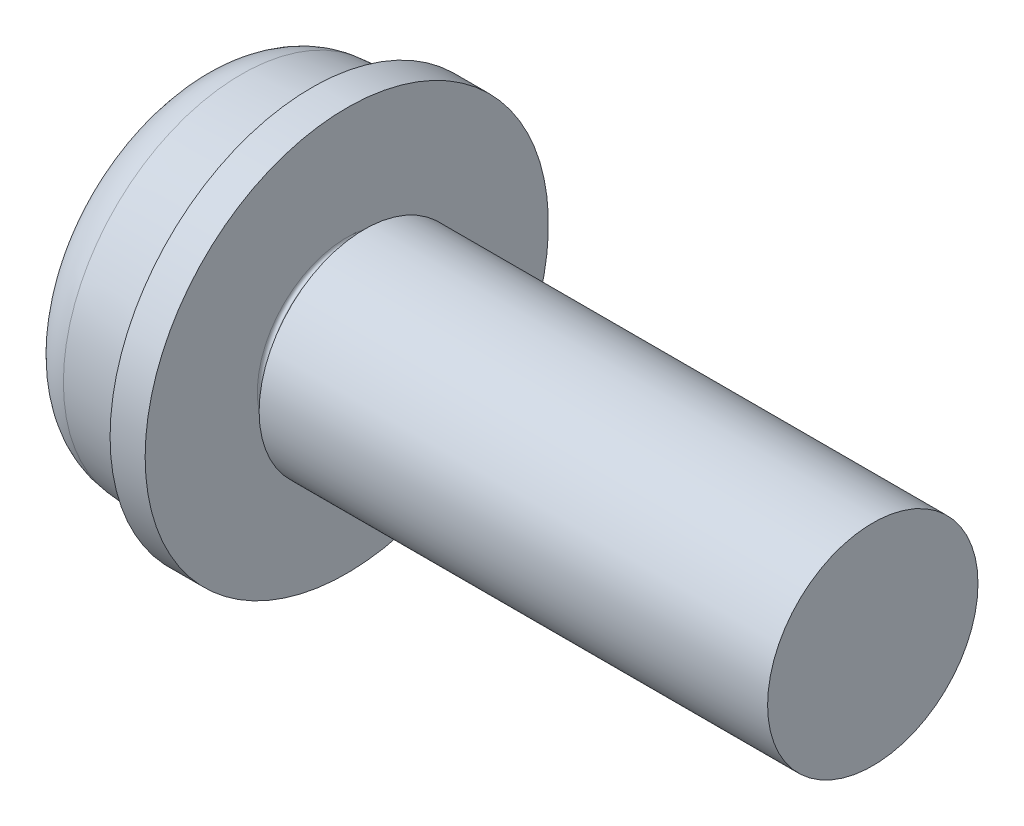
ISO-10303-21;
HEADER;
FILE_DESCRIPTION(('STEP AP214'),'2;1');
FILE_NAME('part.step','',(''),(''),'','','');
FILE_SCHEMA(('AUTOMOTIVE_DESIGN { 1 0 10303 214 1 1 1 1 }'));
ENDSEC;
DATA;
#1=APPLICATION_CONTEXT('core data for automotive mechanical design processes');
#2=APPLICATION_PROTOCOL_DEFINITION('international standard','automotive_design',2000,#1);
#3=PRODUCT_CONTEXT('',#1,'mechanical');
#4=PRODUCT('Part','Part','',(#3));
#5=PRODUCT_RELATED_PRODUCT_CATEGORY('part','',(#4));
#6=PRODUCT_DEFINITION_FORMATION('','',#4);
#7=PRODUCT_DEFINITION_CONTEXT('part definition',#1,'design');
#8=PRODUCT_DEFINITION('design','',#6,#7);
#9=PRODUCT_DEFINITION_SHAPE('','',#8);
#10=(LENGTH_UNIT() NAMED_UNIT(*) SI_UNIT(.MILLI.,.METRE.));
#11=(NAMED_UNIT(*) PLANE_ANGLE_UNIT() SI_UNIT($,.RADIAN.));
#12=(NAMED_UNIT(*) SI_UNIT($,.STERADIAN.) SOLID_ANGLE_UNIT());
#13=UNCERTAINTY_MEASURE_WITH_UNIT(LENGTH_MEASURE(1.E-05),#10,'distance_accuracy_value','');
#14=(GEOMETRIC_REPRESENTATION_CONTEXT(3) GLOBAL_UNCERTAINTY_ASSIGNED_CONTEXT((#13)) GLOBAL_UNIT_ASSIGNED_CONTEXT((#10,
#11,#12)) REPRESENTATION_CONTEXT('',''));
#15=CARTESIAN_POINT('',(0.,0.,0.));
#16=DIRECTION('',(0.,0.,1.));
#17=DIRECTION('',(1.,0.,0.));
#18=AXIS2_PLACEMENT_3D('',#15,#16,#17);
#19=CARTESIAN_POINT('',(9.1,0.,0.));
#20=DIRECTION('',(-1.,0.,0.));
#21=DIRECTION('',(0.,1.,0.));
#22=AXIS2_PLACEMENT_3D('',#19,#20,#21);
#23=SPHERICAL_SURFACE('',#22,14.);
#24=CARTESIAN_POINT('',(-4.31350463906351,0.,0.));
#25=DIRECTION('',(-1.,0.,0.));
#26=DIRECTION('',(0.,0.,1.));
#27=AXIS2_PLACEMENT_3D('',#24,#25,#26);
#28=CIRCLE('',#27,4.00972484066197);
#29=CARTESIAN_POINT('',(-4.31350463906351,0.,4.00972484066197));
#30=VERTEX_POINT('',#29);
#31=EDGE_CURVE('E167',#30,#30,#28,.T.);
#32=ORIENTED_EDGE('',*,*,#31,.T.);
#33=EDGE_LOOP('',(#32));
#34=FACE_BOUND('',#33,.T.);
#35=CARTESIAN_POINT('',(8.92668313288327,0.,1.2332135886609));
#36=DIRECTION('',(0.139173100960066,0.,-0.99026806874157));
#37=DIRECTION('',(-0.99026806874157,0.,-0.139173100960066));
#38=AXIS2_PLACEMENT_3D('',#35,#36,#37);
#39=CIRCLE('',#38,13.9445023399301);
#40=CARTESIAN_POINT('',(-4.84584346606306,-1.01,-0.702388795515914));
#41=VERTEX_POINT('',#40);
#42=CARTESIAN_POINT('',(-4.53679780093225,-3.09895525977727,-0.658955259777274));
#43=VERTEX_POINT('',#42);
#44=EDGE_CURVE('E363',#41,#43,#39,.F.);
#45=ORIENTED_EDGE('',*,*,#44,.F.);
#46=CARTESIAN_POINT('',(-4.8458290785846,-0.7023868385044,-1.0102));
#47=CARTESIAN_POINT('',(-4.84708388610302,-0.702536676377548,-0.992777773493148));
#48=CARTESIAN_POINT('',(-4.84822929380406,-0.704180738839417,-0.975364879115652));
#49=CARTESIAN_POINT('',(-4.85027318821373,-0.710351036853501,-0.941053438100775));
#50=CARTESIAN_POINT('',(-4.85117183014735,-0.714875454581597,-0.924154574096054));
#51=CARTESIAN_POINT('',(-4.85269618046307,-0.726704189137661,-0.891333839014385));
#52=CARTESIAN_POINT('',(-4.85332172469378,-0.734010172962371,-0.875412560463392));
#53=CARTESIAN_POINT('',(-4.85428109679974,-0.751191281741183,-0.845018026603912));
#54=CARTESIAN_POINT('',(-4.85461499630027,-0.7610657751193,-0.830544416534941));
#55=CARTESIAN_POINT('',(-4.85498084739501,-0.783068505049483,-0.803502452250238));
#56=CARTESIAN_POINT('',(-4.85501380691679,-0.795189079590011,-0.790927876956896));
#57=CARTESIAN_POINT('',(-4.85477941601099,-0.821364083440518,-0.767981397041987));
#58=CARTESIAN_POINT('',(-4.85451200043001,-0.835418931727255,-0.757609970878752));
#59=CARTESIAN_POINT('',(-4.85368509863413,-0.865042264989082,-0.739375800014515));
#60=CARTESIAN_POINT('',(-4.85312589944981,-0.880609250233723,-0.731510602135563));
#61=CARTESIAN_POINT('',(-4.85173170842112,-0.912823443481566,-0.718496661243508));
#62=CARTESIAN_POINT('',(-4.85089689415104,-0.929469950431944,-0.713346174719539));
#63=CARTESIAN_POINT('',(-4.84934304116498,-0.95689553597486,-0.70731573609252));
#64=CARTESIAN_POINT('',(-4.84870106573489,-0.967493795183981,-0.705556365935137));
#65=CARTESIAN_POINT('',(-4.84732929811825,-0.988792482108806,-0.703143014985901));
#66=CARTESIAN_POINT('',(-4.84659964885771,-0.999492718047994,-0.702487260582832));
#67=CARTESIAN_POINT('',(-4.84582907858494,-1.01019999999993,-0.702386838504014));
#68=B_SPLINE_CURVE_WITH_KNOTS('',3,(#46,#47,#48,#49,#50,#51,#52,#53,#54,#55,#56,#57,#58,#59,#60,
#61,#62,#63,#64,#65,#66,#67),.UNSPECIFIED.,.F.,.F.,(4,2,2,2,2,2,2,2,2,2,4),(0.,
0.0523367764548876,0.104640555290392,0.156975729326891,0.209298046707228,0.261445058265805,
0.313603383049545,0.36571049560742,0.417784101708391,0.450018534773868,0.482201114521501),.UNSPECIFIED.);
#69=CARTESIAN_POINT('',(-4.84584346606306,-0.702388795515915,-1.01));
#70=VERTEX_POINT('',#69);
#71=EDGE_CURVE('E59',#70,#41,#68,.T.);
#72=ORIENTED_EDGE('',*,*,#71,.F.);
#73=CARTESIAN_POINT('',(8.92668313288327,1.23321358866089,0.));
#74=DIRECTION('',(0.139173100960066,-0.99026806874157,0.));
#75=DIRECTION('',(0.99026806874157,0.139173100960066,0.));
#76=AXIS2_PLACEMENT_3D('',#73,#74,#75);
#77=CIRCLE('',#76,13.9445023399301);
#78=CARTESIAN_POINT('',(-4.53679780093225,-0.658955259777275,-3.09895525977728));
#79=VERTEX_POINT('',#78);
#80=EDGE_CURVE('E364',#70,#79,#77,.T.);
#81=ORIENTED_EDGE('',*,*,#80,.T.);
#82=CARTESIAN_POINT('',(9.26296070698001,0.,-1.15952568038386));
#83=DIRECTION('',(0.139173100960066,0.,-0.99026806874157));
#84=DIRECTION('',(-0.99026806874157,0.,-0.139173100960066));
#85=AXIS2_PLACEMENT_3D('',#82,#83,#84);
#86=CIRCLE('',#85,13.950947781585);
#87=CARTESIAN_POINT('',(-4.53679780093225,0.658955259777274,-3.09895525977728));
#88=VERTEX_POINT('',#87);
#89=EDGE_CURVE('E424',#88,#79,#86,.F.);
#90=ORIENTED_EDGE('',*,*,#89,.F.);
#91=CARTESIAN_POINT('',(8.92668313288327,-1.23321358866089,0.));
#92=DIRECTION('',(0.139173100960066,0.99026806874157,0.));
#93=DIRECTION('',(-0.99026806874157,0.139173100960066,0.));
#94=AXIS2_PLACEMENT_3D('',#91,#92,#93);
#95=CIRCLE('',#94,13.9445023399301);
#96=CARTESIAN_POINT('',(-4.84584346606306,0.702388795515914,-1.01));
#97=VERTEX_POINT('',#96);
#98=EDGE_CURVE('E331',#88,#97,#95,.T.);
#99=ORIENTED_EDGE('',*,*,#98,.T.);
#100=CARTESIAN_POINT('',(-4.8458290785846,1.0102,-0.702386838504399));
#101=CARTESIAN_POINT('',(-4.84708388610302,0.992777773493148,-0.702536676377547));
#102=CARTESIAN_POINT('',(-4.84822929380406,0.975364879115652,-0.704180738839416));
#103=CARTESIAN_POINT('',(-4.85027318821373,0.941053438100776,-0.7103510368535));
#104=CARTESIAN_POINT('',(-4.85117183014735,0.924154574096054,-0.714875454581596));
#105=CARTESIAN_POINT('',(-4.85269618046307,0.891333839014385,-0.72670418913766));
#106=CARTESIAN_POINT('',(-4.85332172469378,0.875412560463392,-0.73401017296237));
#107=CARTESIAN_POINT('',(-4.85428109679974,0.845018026603912,-0.751191281741182));
#108=CARTESIAN_POINT('',(-4.85461499630027,0.830544416534941,-0.761065775119299));
#109=CARTESIAN_POINT('',(-4.85498084739501,0.803502452250238,-0.783068505049482));
#110=CARTESIAN_POINT('',(-4.85501380691679,0.790927876956896,-0.79518907959001));
#111=CARTESIAN_POINT('',(-4.85477941601099,0.767981397041987,-0.821364083440517));
#112=CARTESIAN_POINT('',(-4.85451200043001,0.757609970878752,-0.835418931727254));
#113=CARTESIAN_POINT('',(-4.85368509863413,0.739375800014515,-0.865042264989082));
#114=CARTESIAN_POINT('',(-4.85312589944981,0.731510602135563,-0.880609250233722));
#115=CARTESIAN_POINT('',(-4.85173170842112,0.718496661243508,-0.912823443481565));
#116=CARTESIAN_POINT('',(-4.85089689415104,0.713346174719539,-0.929469950431943));
#117=CARTESIAN_POINT('',(-4.84934304116498,0.70731573609252,-0.956895535974859));
#118=CARTESIAN_POINT('',(-4.84870106573489,0.705556365935137,-0.96749379518398));
#119=CARTESIAN_POINT('',(-4.84732929811825,0.703143014985901,-0.988792482108805));
#120=CARTESIAN_POINT('',(-4.84659964885771,0.702487260582832,-0.999492718047993));
#121=CARTESIAN_POINT('',(-4.84582907858494,0.702386838504014,-1.01019999999993));
#122=B_SPLINE_CURVE_WITH_KNOTS('',3,(#100,#101,#102,#103,#104,#105,#106,#107,#108,#109,#110,
#111,#112,#113,#114,#115,#116,#117,#118,#119,#120,#121),.UNSPECIFIED.,.F.,.F.,(4,2,2,2,2,2,2,2,
2,2,4),(0.,0.0523367764548876,0.104640555290392,0.156975729326891,0.209298046707228,
0.261445058265805,0.313603383049545,0.36571049560742,0.417784101708391,0.450018534773868,
0.482201114521501),.UNSPECIFIED.);
#123=CARTESIAN_POINT('',(-4.84584346606306,1.01,-0.702388795515914));
#124=VERTEX_POINT('',#123);
#125=EDGE_CURVE('E325',#124,#97,#122,.T.);
#126=ORIENTED_EDGE('',*,*,#125,.F.);
#127=CARTESIAN_POINT('',(8.92668313288327,0.,1.2332135886609));
#128=DIRECTION('',(0.139173100960066,0.,-0.99026806874157));
#129=DIRECTION('',(-0.99026806874157,0.,-0.139173100960066));
#130=AXIS2_PLACEMENT_3D('',#127,#128,#129);
#131=CIRCLE('',#130,13.9445023399301);
#132=CARTESIAN_POINT('',(-4.53679780093225,3.09895525977727,-0.658955259777275));
#133=VERTEX_POINT('',#132);
#134=EDGE_CURVE('E323',#133,#124,#131,.F.);
#135=ORIENTED_EDGE('',*,*,#134,.F.);
#136=CARTESIAN_POINT('',(9.26296070698001,1.15952568038385,0.));
#137=DIRECTION('',(0.139173100960066,0.99026806874157,0.));
#138=DIRECTION('',(-0.99026806874157,0.139173100960066,0.));
#139=AXIS2_PLACEMENT_3D('',#136,#137,#138);
#140=CIRCLE('',#139,13.950947781585);
#141=CARTESIAN_POINT('',(-4.53679780093225,3.09895525977727,0.658955259777274));
#142=VERTEX_POINT('',#141);
#143=EDGE_CURVE('E320',#133,#142,#140,.T.);
#144=ORIENTED_EDGE('',*,*,#143,.T.);
#145=CARTESIAN_POINT('',(8.92668313288327,0.,-1.2332135886609));
#146=DIRECTION('',(0.139173100960066,0.,0.99026806874157));
#147=DIRECTION('',(0.99026806874157,0.,-0.139173100960066));
#148=AXIS2_PLACEMENT_3D('',#145,#146,#147);
#149=CIRCLE('',#148,13.9445023399301);
#150=CARTESIAN_POINT('',(-4.84584346606306,1.01,0.702388795515914));
#151=VERTEX_POINT('',#150);
#152=EDGE_CURVE('E317',#151,#142,#149,.F.);
#153=ORIENTED_EDGE('',*,*,#152,.F.);
#154=CARTESIAN_POINT('',(-4.8458290785846,1.0102,0.702386838504399));
#155=CARTESIAN_POINT('',(-4.84708388610302,0.992777773493148,0.702536676377546));
#156=CARTESIAN_POINT('',(-4.84822929380406,0.975364879115652,0.704180738839415));
#157=CARTESIAN_POINT('',(-4.85027318821373,0.941053438100775,0.7103510368535));
#158=CARTESIAN_POINT('',(-4.85117183014735,0.924154574096054,0.714875454581595));
#159=CARTESIAN_POINT('',(-4.85269618046307,0.891333839014385,0.72670418913766));
#160=CARTESIAN_POINT('',(-4.85332172469378,0.875412560463392,0.73401017296237));
#161=CARTESIAN_POINT('',(-4.85428109679974,0.845018026603912,0.751191281741181));
#162=CARTESIAN_POINT('',(-4.85461499630027,0.830544416534941,0.761065775119298));
#163=CARTESIAN_POINT('',(-4.85498084739501,0.803502452250238,0.783068505049481));
#164=CARTESIAN_POINT('',(-4.85501380691679,0.790927876956896,0.79518907959001));
#165=CARTESIAN_POINT('',(-4.85477941601099,0.767981397041987,0.821364083440517));
#166=CARTESIAN_POINT('',(-4.85451200043001,0.757609970878752,0.835418931727254));
#167=CARTESIAN_POINT('',(-4.85368509863413,0.739375800014515,0.865042264989081));
#168=CARTESIAN_POINT('',(-4.85312589944981,0.731510602135563,0.880609250233721));
#169=CARTESIAN_POINT('',(-4.85173170842112,0.718496661243508,0.912823443481565));
#170=CARTESIAN_POINT('',(-4.85089689415104,0.713346174719538,0.929469950431943));
#171=CARTESIAN_POINT('',(-4.84934304116498,0.70731573609252,0.956895535974859));
#172=CARTESIAN_POINT('',(-4.84870106573489,0.705556365935137,0.96749379518398));
#173=CARTESIAN_POINT('',(-4.84732929811825,0.703143014985901,0.988792482108805));
#174=CARTESIAN_POINT('',(-4.84659964885771,0.702487260582832,0.999492718047992));
#175=CARTESIAN_POINT('',(-4.84582907858494,0.702386838504014,1.01019999999993));
#176=B_SPLINE_CURVE_WITH_KNOTS('',3,(#154,#155,#156,#157,#158,#159,#160,#161,#162,#163,#164,
#165,#166,#167,#168,#169,#170,#171,#172,#173,#174,#175),.UNSPECIFIED.,.F.,.F.,(4,2,2,2,2,2,2,2,
2,2,4),(0.,0.0523367764548876,0.104640555290392,0.156975729326891,0.209298046707228,
0.261445058265805,0.313603383049545,0.36571049560742,0.417784101708391,0.450018534773868,
0.482201114521501),.UNSPECIFIED.);
#177=CARTESIAN_POINT('',(-4.84584346606306,0.702388795515914,1.01));
#178=VERTEX_POINT('',#177);
#179=EDGE_CURVE('E310',#151,#178,#176,.T.);
#180=ORIENTED_EDGE('',*,*,#179,.T.);
#181=CARTESIAN_POINT('',(8.92668313288327,-1.2332135886609,0.));
#182=DIRECTION('',(0.139173100960066,0.99026806874157,0.));
#183=DIRECTION('',(-0.99026806874157,0.139173100960066,0.));
#184=AXIS2_PLACEMENT_3D('',#181,#182,#183);
#185=CIRCLE('',#184,13.9445023399301);
#186=CARTESIAN_POINT('',(-4.53679780093225,0.658955259777274,3.09895525977727));
#187=VERTEX_POINT('',#186);
#188=EDGE_CURVE('E318',#178,#187,#185,.T.);
#189=ORIENTED_EDGE('',*,*,#188,.T.);
#190=CARTESIAN_POINT('',(9.26296070698001,0.,1.15952568038385));
#191=DIRECTION('',(0.139173100960066,0.,0.99026806874157));
#192=DIRECTION('',(0.99026806874157,0.,-0.139173100960066));
#193=AXIS2_PLACEMENT_3D('',#190,#191,#192);
#194=CIRCLE('',#193,13.950947781585);
#195=CARTESIAN_POINT('',(-4.53679780093225,-0.658955259777274,3.09895525977727));
#196=VERTEX_POINT('',#195);
#197=EDGE_CURVE('E402',#196,#187,#194,.F.);
#198=ORIENTED_EDGE('',*,*,#197,.F.);
#199=CARTESIAN_POINT('',(8.92668313288327,1.23321358866089,0.));
#200=DIRECTION('',(0.139173100960066,-0.99026806874157,0.));
#201=DIRECTION('',(0.99026806874157,0.139173100960066,0.));
#202=AXIS2_PLACEMENT_3D('',#199,#200,#201);
#203=CIRCLE('',#202,13.9445023399301);
#204=CARTESIAN_POINT('',(-4.84584346606306,-0.702388795515915,1.01));
#205=VERTEX_POINT('',#204);
#206=EDGE_CURVE('E278',#196,#205,#203,.T.);
#207=ORIENTED_EDGE('',*,*,#206,.T.);
#208=CARTESIAN_POINT('',(-4.8458290785846,-1.0102,0.702386838504399));
#209=CARTESIAN_POINT('',(-4.84708388610302,-0.992777773493149,0.702536676377546));
#210=CARTESIAN_POINT('',(-4.84822929380406,-0.975364879115653,0.704180738839415));
#211=CARTESIAN_POINT('',(-4.85027318821373,-0.941053438100777,0.7103510368535));
#212=CARTESIAN_POINT('',(-4.85117183014735,-0.924154574096055,0.714875454581595));
#213=CARTESIAN_POINT('',(-4.85269618046307,-0.891333839014386,0.72670418913766));
#214=CARTESIAN_POINT('',(-4.85332172469378,-0.875412560463393,0.734010172962369));
#215=CARTESIAN_POINT('',(-4.85428109679974,-0.845018026603913,0.751191281741181));
#216=CARTESIAN_POINT('',(-4.85461499630027,-0.830544416534942,0.761065775119298));
#217=CARTESIAN_POINT('',(-4.85498084739501,-0.803502452250239,0.783068505049481));
#218=CARTESIAN_POINT('',(-4.85501380691679,-0.790927876956897,0.795189079590009));
#219=CARTESIAN_POINT('',(-4.85477941601099,-0.767981397041988,0.821364083440516));
#220=CARTESIAN_POINT('',(-4.85451200043001,-0.757609970878753,0.835418931727253));
#221=CARTESIAN_POINT('',(-4.85368509863413,-0.739375800014516,0.865042264989081));
#222=CARTESIAN_POINT('',(-4.85312589944981,-0.731510602135564,0.880609250233721));
#223=CARTESIAN_POINT('',(-4.85173170842112,-0.718496661243509,0.912823443481564));
#224=CARTESIAN_POINT('',(-4.85089689415104,-0.71334617471954,0.929469950431942));
#225=CARTESIAN_POINT('',(-4.84934304116498,-0.707315736092521,0.956895535974858));
#226=CARTESIAN_POINT('',(-4.84870106573489,-0.705556365935138,0.96749379518398));
#227=CARTESIAN_POINT('',(-4.84732929811825,-0.703143014985902,0.988792482108804));
#228=CARTESIAN_POINT('',(-4.84659964885771,-0.702487260582833,0.999492718047992));
#229=CARTESIAN_POINT('',(-4.84582907858494,-0.702386838504015,1.01019999999993));
#230=B_SPLINE_CURVE_WITH_KNOTS('',3,(#208,#209,#210,#211,#212,#213,#214,#215,#216,#217,#218,
#219,#220,#221,#222,#223,#224,#225,#226,#227,#228,#229),.UNSPECIFIED.,.F.,.F.,(4,2,2,2,2,2,2,2,
2,2,4),(0.,0.0523367764548875,0.104640555290392,0.156975729326891,0.209298046707228,
0.261445058265805,0.313603383049545,0.36571049560742,0.417784101708391,0.450018534773868,
0.482201114521501),.UNSPECIFIED.);
#231=CARTESIAN_POINT('',(-4.84584346606306,-1.01,0.702388795515913));
#232=VERTEX_POINT('',#231);
#233=EDGE_CURVE('E272',#232,#205,#230,.T.);
#234=ORIENTED_EDGE('',*,*,#233,.F.);
#235=CARTESIAN_POINT('',(8.92668313288327,0.,-1.2332135886609));
#236=DIRECTION('',(0.139173100960066,0.,0.99026806874157));
#237=DIRECTION('',(0.99026806874157,0.,-0.139173100960066));
#238=AXIS2_PLACEMENT_3D('',#235,#236,#237);
#239=CIRCLE('',#238,13.9445023399301);
#240=CARTESIAN_POINT('',(-4.53679780093225,-3.09895525977727,0.658955259777276));
#241=VERTEX_POINT('',#240);
#242=EDGE_CURVE('E270',#241,#232,#239,.F.);
#243=ORIENTED_EDGE('',*,*,#242,.F.);
#244=CARTESIAN_POINT('',(9.26296070698001,-1.15952568038385,0.));
#245=DIRECTION('',(0.139173100960066,-0.99026806874157,0.));
#246=DIRECTION('',(0.99026806874157,0.139173100960066,0.));
#247=AXIS2_PLACEMENT_3D('',#244,#245,#246);
#248=CIRCLE('',#247,13.950947781585);
#249=EDGE_CURVE('E267',#241,#43,#248,.T.);
#250=ORIENTED_EDGE('',*,*,#249,.T.);
#251=EDGE_LOOP('',(#45,#72,#81,#90,#99,#126,#135,#144,#153,#180,#189,#198,#207,#234,#243,#250));
#252=FACE_BOUND('',#251,.T.);
#253=ADVANCED_FACE('F36',(#34,#252),#23,.T.);
#254=CARTESIAN_POINT('',(15.,3.,0.));
#255=DIRECTION('',(1.,0.,0.));
#256=DIRECTION('',(0.,0.,-1.));
#257=AXIS2_PLACEMENT_3D('',#254,#255,#256);
#258=PLANE('',#257);
#259=CARTESIAN_POINT('',(15.,0.,0.));
#260=DIRECTION('',(-1.,0.,0.));
#261=DIRECTION('',(0.,0.,1.));
#262=AXIS2_PLACEMENT_3D('',#259,#260,#261);
#263=CIRCLE('',#262,3.);
#264=CARTESIAN_POINT('',(15.,0.,3.));
#265=VERTEX_POINT('',#264);
#266=EDGE_CURVE('E264',#265,#265,#263,.T.);
#267=ORIENTED_EDGE('',*,*,#266,.F.);
#268=EDGE_LOOP('',(#267));
#269=FACE_BOUND('',#268,.T.);
#270=ADVANCED_FACE('F380',(#269),#258,.T.);
#271=CARTESIAN_POINT('',(0.,0.,0.));
#272=DIRECTION('',(-1.,0.,0.));
#273=DIRECTION('',(0.,0.,1.));
#274=AXIS2_PLACEMENT_3D('',#271,#272,#273);
#275=CYLINDRICAL_SURFACE('',#274,3.);
#276=ORIENTED_EDGE('',*,*,#266,.T.);
#277=EDGE_LOOP('',(#276));
#278=FACE_BOUND('',#277,.T.);
#279=CARTESIAN_POINT('',(0.5,0.,0.));
#280=DIRECTION('',(-1.,0.,0.));
#281=DIRECTION('',(0.,0.,1.));
#282=AXIS2_PLACEMENT_3D('',#279,#280,#281);
#283=CIRCLE('',#282,3.);
#284=CARTESIAN_POINT('',(0.5,0.,3.));
#285=VERTEX_POINT('',#284);
#286=EDGE_CURVE('E261',#285,#285,#283,.T.);
#287=ORIENTED_EDGE('',*,*,#286,.F.);
#288=EDGE_LOOP('',(#287));
#289=FACE_BOUND('',#288,.T.);
#290=ADVANCED_FACE('F385',(#278,#289),#275,.T.);
#291=CARTESIAN_POINT('',(0.5,2.45,0.));
#292=DIRECTION('',(-1.,0.,0.));
#293=DIRECTION('',(0.,0.,1.));
#294=AXIS2_PLACEMENT_3D('',#291,#292,#293);
#295=PLANE('',#294);
#296=ORIENTED_EDGE('',*,*,#286,.T.);
#297=EDGE_LOOP('',(#296));
#298=FACE_BOUND('',#297,.T.);
#299=CARTESIAN_POINT('',(0.5,0.,0.));
#300=DIRECTION('',(-1.,0.,0.));
#301=DIRECTION('',(0.,0.,1.));
#302=AXIS2_PLACEMENT_3D('',#299,#300,#301);
#303=CIRCLE('',#302,2.45);
#304=CARTESIAN_POINT('',(0.5,0.,2.45));
#305=VERTEX_POINT('',#304);
#306=EDGE_CURVE('E258',#305,#305,#303,.T.);
#307=ORIENTED_EDGE('',*,*,#306,.F.);
#308=EDGE_LOOP('',(#307));
#309=FACE_BOUND('',#308,.T.);
#310=ADVANCED_FACE('F503',(#298,#309),#295,.T.);
#311=CARTESIAN_POINT('',(0.,0.,0.));
#312=DIRECTION('',(-1.,0.,0.));
#313=DIRECTION('',(0.,0.,1.));
#314=AXIS2_PLACEMENT_3D('',#311,#312,#313);
#315=CYLINDRICAL_SURFACE('',#314,2.45);
#316=CARTESIAN_POINT('',(0.1,0.,0.));
#317=DIRECTION('',(1.,0.,0.));
#318=DIRECTION('',(0.,0.,-1.));
#319=AXIS2_PLACEMENT_3D('',#316,#317,#318);
#320=CIRCLE('',#319,2.45);
#321=CARTESIAN_POINT('',(0.1,0.,-2.45));
#322=VERTEX_POINT('',#321);
#323=EDGE_CURVE('E11',#322,#322,#320,.T.);
#324=ORIENTED_EDGE('',*,*,#323,.T.);
#325=EDGE_LOOP('',(#324));
#326=FACE_BOUND('',#325,.T.);
#327=ORIENTED_EDGE('',*,*,#306,.T.);
#328=EDGE_LOOP('',(#327));
#329=FACE_BOUND('',#328,.T.);
#330=ADVANCED_FACE('F496',(#326,#329),#315,.T.);
#331=CARTESIAN_POINT('',(0.,5.75,0.));
#332=DIRECTION('',(1.,0.,0.));
#333=DIRECTION('',(0.,0.,-1.));
#334=AXIS2_PLACEMENT_3D('',#331,#332,#333);
#335=PLANE('',#334);
#336=CARTESIAN_POINT('',(0.,0.,0.));
#337=DIRECTION('',(1.,0.,0.));
#338=DIRECTION('',(0.,0.,-1.));
#339=AXIS2_PLACEMENT_3D('',#336,#337,#338);
#340=CIRCLE('',#339,2.55);
#341=CARTESIAN_POINT('',(0.,0.,-2.55));
#342=VERTEX_POINT('',#341);
#343=EDGE_CURVE('E44',#342,#342,#340,.F.);
#344=ORIENTED_EDGE('',*,*,#343,.T.);
#345=EDGE_LOOP('',(#344));
#346=FACE_BOUND('',#345,.T.);
#347=CARTESIAN_POINT('',(0.,0.,0.));
#348=DIRECTION('',(-1.,0.,0.));
#349=DIRECTION('',(0.,0.,1.));
#350=AXIS2_PLACEMENT_3D('',#347,#348,#349);
#351=CIRCLE('',#350,5.75);
#352=CARTESIAN_POINT('',(0.,0.,5.75));
#353=VERTEX_POINT('',#352);
#354=EDGE_CURVE('E255',#353,#353,#351,.T.);
#355=ORIENTED_EDGE('',*,*,#354,.F.);
#356=EDGE_LOOP('',(#355));
#357=FACE_BOUND('',#356,.T.);
#358=ADVANCED_FACE('F368',(#346,#357),#335,.T.);
#359=CARTESIAN_POINT('',(0.,0.,0.));
#360=DIRECTION('',(-1.,0.,0.));
#361=DIRECTION('',(0.,0.,1.));
#362=AXIS2_PLACEMENT_3D('',#359,#360,#361);
#363=CYLINDRICAL_SURFACE('',#362,5.75);
#364=CARTESIAN_POINT('',(-1.,0.,0.));
#365=DIRECTION('',(-1.,0.,0.));
#366=DIRECTION('',(0.,0.,1.));
#367=AXIS2_PLACEMENT_3D('',#364,#365,#366);
#368=CIRCLE('',#367,5.75);
#369=CARTESIAN_POINT('',(-1.,0.,5.75));
#370=VERTEX_POINT('',#369);
#371=EDGE_CURVE('E252',#370,#370,#368,.T.);
#372=ORIENTED_EDGE('',*,*,#371,.F.);
#373=EDGE_LOOP('',(#372));
#374=FACE_BOUND('',#373,.T.);
#375=ORIENTED_EDGE('',*,*,#354,.T.);
#376=EDGE_LOOP('',(#375));
#377=FACE_BOUND('',#376,.T.);
#378=ADVANCED_FACE('F480',(#374,#377),#363,.T.);
#379=CARTESIAN_POINT('',(-1.,5.75,0.));
#380=DIRECTION('',(1.,0.,0.));
#381=DIRECTION('',(0.,0.,-1.));
#382=AXIS2_PLACEMENT_3D('',#379,#380,#381);
#383=PLANE('',#382);
#384=CARTESIAN_POINT('',(-1.,0.,0.));
#385=DIRECTION('',(-1.,0.,0.));
#386=DIRECTION('',(0.,0.,1.));
#387=AXIS2_PLACEMENT_3D('',#384,#385,#386);
#388=CIRCLE('',#387,5.25);
#389=CARTESIAN_POINT('',(-1.,0.,5.25));
#390=VERTEX_POINT('',#389);
#391=EDGE_CURVE('E249',#390,#390,#388,.T.);
#392=ORIENTED_EDGE('',*,*,#391,.F.);
#393=EDGE_LOOP('',(#392));
#394=FACE_BOUND('',#393,.T.);
#395=ORIENTED_EDGE('',*,*,#371,.T.);
#396=EDGE_LOOP('',(#395));
#397=FACE_BOUND('',#396,.T.);
#398=ADVANCED_FACE('F473',(#394,#397),#383,.F.);
#399=CARTESIAN_POINT('',(-3.00707704185677,0.,0.));
#400=DIRECTION('',(1.,0.,0.));
#401=DIRECTION('',(0.,0.,-1.));
#402=AXIS2_PLACEMENT_3D('',#399,#400,#401);
#403=CONICAL_SURFACE('',#402,5.07440351201438,0.0872664625997204);
#404=ORIENTED_EDGE('',*,*,#391,.T.);
#405=EDGE_LOOP('',(#404));
#406=FACE_BOUND('',#405,.T.);
#407=CARTESIAN_POINT('',(-3.00707704185677,0.,0.));
#408=DIRECTION('',(-1.,0.,0.));
#409=DIRECTION('',(0.,0.,1.));
#410=AXIS2_PLACEMENT_3D('',#407,#408,#409);
#411=CIRCLE('',#410,5.07440351201438);
#412=CARTESIAN_POINT('',(-3.00707704185677,0.,5.07440351201438));
#413=VERTEX_POINT('',#412);
#414=EDGE_CURVE('E171',#413,#413,#411,.T.);
#415=ORIENTED_EDGE('',*,*,#414,.F.);
#416=EDGE_LOOP('',(#415));
#417=FACE_BOUND('',#416,.T.);
#418=ADVANCED_FACE('F466',(#406,#417),#403,.T.);
#419=CARTESIAN_POINT('',(-2.87634342773528,0.,0.));
#420=DIRECTION('',(-1.,0.,0.));
#421=DIRECTION('',(0.,0.,1.));
#422=AXIS2_PLACEMENT_3D('',#419,#420,#421);
#423=TOROIDAL_SURFACE('',#422,3.58011146487676,1.5);
#424=ORIENTED_EDGE('',*,*,#414,.T.);
#425=EDGE_LOOP('',(#424));
#426=FACE_BOUND('',#425,.T.);
#427=ORIENTED_EDGE('',*,*,#31,.F.);
#428=EDGE_LOOP('',(#427));
#429=FACE_BOUND('',#428,.T.);
#430=ADVANCED_FACE('F355',(#426,#429),#423,.T.);
#431=CARTESIAN_POINT('',(-4.9,-3.15,-0.71));
#432=DIRECTION('',(0.139173100960066,0.,-0.99026806874157));
#433=DIRECTION('',(-0.99026806874157,0.,-0.139173100960066));
#434=AXIS2_PLACEMENT_3D('',#431,#432,#433);
#435=PLANE('',#434);
#436=ORIENTED_EDGE('',*,*,#44,.T.);
#437=DIRECTION('',(0.980814848463989,0.137844537491629,0.137844537491629));
#438=VECTOR('',#437,1.);
#439=CARTESIAN_POINT('',(-4.9,-3.15,-0.71));
#440=LINE('',#439,#438);
#441=CARTESIAN_POINT('',(-2.9,-2.86891833059522,-0.428918330595216));
#442=VERTEX_POINT('',#441);
#443=EDGE_CURVE('E51',#442,#43,#440,.F.);
#444=ORIENTED_EDGE('',*,*,#443,.F.);
#445=DIRECTION('',(0.,-1.,0.));
#446=VECTOR('',#445,1.);
#447=CARTESIAN_POINT('',(-2.9,-1.01,-0.428918330595217));
#448=LINE('',#447,#446);
#449=CARTESIAN_POINT('',(-2.9,-1.01,-0.428918330595217));
#450=VERTEX_POINT('',#449);
#451=EDGE_CURVE('E155',#442,#450,#448,.F.);
#452=ORIENTED_EDGE('',*,*,#451,.T.);
#453=DIRECTION('',(-0.99026806874157,0.,-0.139173100960066));
#454=VECTOR('',#453,1.);
#455=CARTESIAN_POINT('',(-4.9,-1.01,-0.71));
#456=LINE('',#455,#454);
#457=EDGE_CURVE('E163',#450,#41,#456,.T.);
#458=ORIENTED_EDGE('',*,*,#457,.T.);
#459=EDGE_LOOP('',(#436,#444,#452,#458));
#460=FACE_BOUND('',#459,.T.);
#461=ADVANCED_FACE('F162',(#460),#435,.F.);
#462=CARTESIAN_POINT('',(-4.9,-1.01,-1.01));
#463=DIRECTION('',(1.,0.,0.));
#464=DIRECTION('',(0.,0.,1.));
#465=AXIS2_PLACEMENT_3D('',#462,#463,#464);
#466=CONICAL_SURFACE('',#465,0.3,0.139626340159547);
#467=ORIENTED_EDGE('',*,*,#71,.T.);
#468=ORIENTED_EDGE('',*,*,#457,.F.);
#469=CARTESIAN_POINT('',(-2.9,-1.01,-1.01));
#470=DIRECTION('',(-1.,0.,0.));
#471=DIRECTION('',(0.,0.,1.));
#472=AXIS2_PLACEMENT_3D('',#469,#470,#471);
#473=CIRCLE('',#472,0.581081669404783);
#474=CARTESIAN_POINT('',(-2.9,-0.428918330595217,-1.01));
#475=VERTEX_POINT('',#474);
#476=EDGE_CURVE('E151',#450,#475,#473,.T.);
#477=ORIENTED_EDGE('',*,*,#476,.T.);
#478=DIRECTION('',(-0.99026806874157,-0.139173100960066,0.));
#479=VECTOR('',#478,1.);
#480=CARTESIAN_POINT('',(-4.9,-0.710000000000001,-1.01));
#481=LINE('',#480,#479);
#482=EDGE_CURVE('E168',#475,#70,#481,.T.);
#483=ORIENTED_EDGE('',*,*,#482,.T.);
#484=EDGE_LOOP('',(#467,#468,#477,#483));
#485=FACE_BOUND('',#484,.T.);
#486=ADVANCED_FACE('F166',(#485),#466,.T.);
#487=CARTESIAN_POINT('',(-4.9,-0.71,-3.15));
#488=DIRECTION('',(0.139173100960066,-0.99026806874157,0.));
#489=DIRECTION('',(0.99026806874157,0.139173100960066,0.));
#490=AXIS2_PLACEMENT_3D('',#487,#488,#489);
#491=PLANE('',#490);
#492=ORIENTED_EDGE('',*,*,#482,.F.);
#493=DIRECTION('',(0.,0.,1.));
#494=VECTOR('',#493,1.);
#495=CARTESIAN_POINT('',(-2.9,-0.428918330595217,-1.01));
#496=LINE('',#495,#494);
#497=CARTESIAN_POINT('',(-2.9,-0.428918330595217,-2.86891833059522));
#498=VERTEX_POINT('',#497);
#499=EDGE_CURVE('E158',#498,#475,#496,.T.);
#500=ORIENTED_EDGE('',*,*,#499,.F.);
#501=DIRECTION('',(0.980814848463989,0.137844537491629,0.137844537491629));
#502=VECTOR('',#501,1.);
#503=CARTESIAN_POINT('',(-4.9,-0.71,-3.15));
#504=LINE('',#503,#502);
#505=EDGE_CURVE('E173',#498,#79,#504,.F.);
#506=ORIENTED_EDGE('',*,*,#505,.T.);
#507=ORIENTED_EDGE('',*,*,#80,.F.);
#508=EDGE_LOOP('',(#492,#500,#506,#507));
#509=FACE_BOUND('',#508,.T.);
#510=ADVANCED_FACE('F347',(#509),#491,.F.);
#511=CARTESIAN_POINT('',(-4.9,-0.71,-3.15));
#512=DIRECTION('',(0.139173100960066,0.,-0.99026806874157));
#513=DIRECTION('',(-0.99026806874157,0.,-0.139173100960066));
#514=AXIS2_PLACEMENT_3D('',#511,#512,#513);
#515=PLANE('',#514);
#516=ORIENTED_EDGE('',*,*,#89,.T.);
#517=ORIENTED_EDGE('',*,*,#505,.F.);
#518=DIRECTION('',(0.,-1.,0.));
#519=VECTOR('',#518,1.);
#520=CARTESIAN_POINT('',(-2.9,-1.01,-2.86891833059522));
#521=LINE('',#520,#519);
#522=CARTESIAN_POINT('',(-2.9,0.428918330595217,-2.86891833059522));
#523=VERTEX_POINT('',#522);
#524=EDGE_CURVE('E217',#498,#523,#521,.F.);
#525=ORIENTED_EDGE('',*,*,#524,.T.);
#526=DIRECTION('',(0.980814848463989,-0.137844537491629,0.137844537491629));
#527=VECTOR('',#526,1.);
#528=CARTESIAN_POINT('',(-4.70801604380495,0.683018414546881,-3.12301841454688));
#529=LINE('',#528,#527);
#530=EDGE_CURVE('E211',#523,#88,#529,.F.);
#531=ORIENTED_EDGE('',*,*,#530,.T.);
#532=EDGE_LOOP('',(#516,#517,#525,#531));
#533=FACE_BOUND('',#532,.T.);
#534=ADVANCED_FACE('F343',(#533),#515,.F.);
#535=CARTESIAN_POINT('',(-4.9,0.71,-1.01));
#536=DIRECTION('',(0.139173100960066,0.99026806874157,0.));
#537=DIRECTION('',(-0.99026806874157,0.139173100960066,0.));
#538=AXIS2_PLACEMENT_3D('',#535,#536,#537);
#539=PLANE('',#538);
#540=ORIENTED_EDGE('',*,*,#530,.F.);
#541=DIRECTION('',(0.,0.,-1.));
#542=VECTOR('',#541,1.);
#543=CARTESIAN_POINT('',(-2.9,0.428918330595217,-1.01));
#544=LINE('',#543,#542);
#545=CARTESIAN_POINT('',(-2.9,0.428918330595217,-1.01));
#546=VERTEX_POINT('',#545);
#547=EDGE_CURVE('E219',#546,#523,#544,.T.);
#548=ORIENTED_EDGE('',*,*,#547,.F.);
#549=DIRECTION('',(-0.99026806874157,0.139173100960066,0.));
#550=VECTOR('',#549,1.);
#551=CARTESIAN_POINT('',(-4.9,0.71,-1.01));
#552=LINE('',#551,#550);
#553=EDGE_CURVE('E208',#546,#97,#552,.T.);
#554=ORIENTED_EDGE('',*,*,#553,.T.);
#555=ORIENTED_EDGE('',*,*,#98,.F.);
#556=EDGE_LOOP('',(#540,#548,#554,#555));
#557=FACE_BOUND('',#556,.T.);
#558=ADVANCED_FACE('F339',(#557),#539,.F.);
#559=CARTESIAN_POINT('',(-4.9,1.01,-1.01));
#560=DIRECTION('',(1.,0.,0.));
#561=DIRECTION('',(0.,0.,1.));
#562=AXIS2_PLACEMENT_3D('',#559,#560,#561);
#563=CONICAL_SURFACE('',#562,0.3,0.139626340159547);
#564=ORIENTED_EDGE('',*,*,#125,.T.);
#565=ORIENTED_EDGE('',*,*,#553,.F.);
#566=CARTESIAN_POINT('',(-2.9,1.01,-1.01));
#567=DIRECTION('',(-1.,0.,0.));
#568=DIRECTION('',(0.,0.,1.));
#569=AXIS2_PLACEMENT_3D('',#566,#567,#568);
#570=CIRCLE('',#569,0.581081669404783);
#571=CARTESIAN_POINT('',(-2.9,1.01,-0.428918330595216));
#572=VERTEX_POINT('',#571);
#573=EDGE_CURVE('E222',#546,#572,#570,.T.);
#574=ORIENTED_EDGE('',*,*,#573,.T.);
#575=DIRECTION('',(-0.99026806874157,0.,-0.139173100960066));
#576=VECTOR('',#575,1.);
#577=CARTESIAN_POINT('',(-4.9,1.01,-0.71));
#578=LINE('',#577,#576);
#579=EDGE_CURVE('E205',#572,#124,#578,.T.);
#580=ORIENTED_EDGE('',*,*,#579,.T.);
#581=EDGE_LOOP('',(#564,#565,#574,#580));
#582=FACE_BOUND('',#581,.T.);
#583=ADVANCED_FACE('F333',(#582),#563,.T.);
#584=CARTESIAN_POINT('',(-4.9,1.01,-0.71));
#585=DIRECTION('',(0.139173100960066,0.,-0.99026806874157));
#586=DIRECTION('',(-0.99026806874157,0.,-0.139173100960066));
#587=AXIS2_PLACEMENT_3D('',#584,#585,#586);
#588=PLANE('',#587);
#589=ORIENTED_EDGE('',*,*,#134,.T.);
#590=ORIENTED_EDGE('',*,*,#579,.F.);
#591=DIRECTION('',(0.,-1.,0.));
#592=VECTOR('',#591,1.);
#593=CARTESIAN_POINT('',(-2.9,-1.01,-0.428918330595216));
#594=LINE('',#593,#592);
#595=CARTESIAN_POINT('',(-2.9,2.86891833059522,-0.428918330595217));
#596=VERTEX_POINT('',#595);
#597=EDGE_CURVE('E224',#572,#596,#594,.F.);
#598=ORIENTED_EDGE('',*,*,#597,.T.);
#599=DIRECTION('',(0.980814848463989,-0.137844537491629,0.137844537491629));
#600=VECTOR('',#599,1.);
#601=CARTESIAN_POINT('',(-4.61067206601592,3.10933761065516,-0.669337610655159));
#602=LINE('',#601,#600);
#603=EDGE_CURVE('E202',#596,#133,#602,.F.);
#604=ORIENTED_EDGE('',*,*,#603,.T.);
#605=EDGE_LOOP('',(#589,#590,#598,#604));
#606=FACE_BOUND('',#605,.T.);
#607=ADVANCED_FACE('F338',(#606),#588,.F.);
#608=CARTESIAN_POINT('',(-4.9,3.15,0.71));
#609=DIRECTION('',(0.139173100960066,0.99026806874157,0.));
#610=DIRECTION('',(-0.99026806874157,0.139173100960066,0.));
#611=AXIS2_PLACEMENT_3D('',#608,#609,#610);
#612=PLANE('',#611);
#613=ORIENTED_EDGE('',*,*,#603,.F.);
#614=DIRECTION('',(0.,0.,-1.));
#615=VECTOR('',#614,1.);
#616=CARTESIAN_POINT('',(-2.9,2.86891833059522,-1.01));
#617=LINE('',#616,#615);
#618=CARTESIAN_POINT('',(-2.9,2.86891833059522,0.428918330595217));
#619=VERTEX_POINT('',#618);
#620=EDGE_CURVE('E226',#619,#596,#617,.T.);
#621=ORIENTED_EDGE('',*,*,#620,.F.);
#622=DIRECTION('',(0.980814848463989,-0.137844537491629,-0.137844537491629));
#623=VECTOR('',#622,1.);
#624=CARTESIAN_POINT('',(-4.9,3.15,0.71));
#625=LINE('',#624,#623);
#626=EDGE_CURVE('E199',#619,#142,#625,.F.);
#627=ORIENTED_EDGE('',*,*,#626,.T.);
#628=ORIENTED_EDGE('',*,*,#143,.F.);
#629=EDGE_LOOP('',(#613,#621,#627,#628));
#630=FACE_BOUND('',#629,.T.);
#631=ADVANCED_FACE('F414',(#630),#612,.F.);
#632=CARTESIAN_POINT('',(-4.9,3.15,0.71));
#633=DIRECTION('',(0.139173100960066,0.,0.99026806874157));
#634=DIRECTION('',(0.99026806874157,0.,-0.139173100960066));
#635=AXIS2_PLACEMENT_3D('',#632,#633,#634);
#636=PLANE('',#635);
#637=ORIENTED_EDGE('',*,*,#152,.T.);
#638=ORIENTED_EDGE('',*,*,#626,.F.);
#639=DIRECTION('',(0.,1.,0.));
#640=VECTOR('',#639,1.);
#641=CARTESIAN_POINT('',(-2.9,-1.01,0.428918330595215));
#642=LINE('',#641,#640);
#643=CARTESIAN_POINT('',(-2.9,1.01,0.428918330595216));
#644=VERTEX_POINT('',#643);
#645=EDGE_CURVE('E229',#619,#644,#642,.F.);
#646=ORIENTED_EDGE('',*,*,#645,.T.);
#647=DIRECTION('',(-0.99026806874157,0.,0.139173100960066));
#648=VECTOR('',#647,1.);
#649=CARTESIAN_POINT('',(-4.9,1.01,0.71));
#650=LINE('',#649,#648);
#651=EDGE_CURVE('E196',#644,#151,#650,.T.);
#652=ORIENTED_EDGE('',*,*,#651,.T.);
#653=EDGE_LOOP('',(#637,#638,#646,#652));
#654=FACE_BOUND('',#653,.T.);
#655=ADVANCED_FACE('F306',(#654),#636,.F.);
#656=CARTESIAN_POINT('',(-4.9,1.01,1.01));
#657=DIRECTION('',(1.,0.,0.));
#658=DIRECTION('',(0.,0.,-1.));
#659=AXIS2_PLACEMENT_3D('',#656,#657,#658);
#660=CONICAL_SURFACE('',#659,0.3,0.139626340159547);
#661=ORIENTED_EDGE('',*,*,#651,.F.);
#662=CARTESIAN_POINT('',(-2.9,1.01,1.01));
#663=DIRECTION('',(-1.,0.,0.));
#664=DIRECTION('',(0.,0.,1.));
#665=AXIS2_PLACEMENT_3D('',#662,#663,#664);
#666=CIRCLE('',#665,0.581081669404783);
#667=CARTESIAN_POINT('',(-2.9,0.428918330595217,1.01));
#668=VERTEX_POINT('',#667);
#669=EDGE_CURVE('E231',#668,#644,#666,.F.);
#670=ORIENTED_EDGE('',*,*,#669,.F.);
#671=DIRECTION('',(-0.99026806874157,0.139173100960066,0.));
#672=VECTOR('',#671,1.);
#673=CARTESIAN_POINT('',(-4.9,0.71,1.01));
#674=LINE('',#673,#672);
#675=EDGE_CURVE('E193',#668,#178,#674,.T.);
#676=ORIENTED_EDGE('',*,*,#675,.T.);
#677=ORIENTED_EDGE('',*,*,#179,.F.);
#678=EDGE_LOOP('',(#661,#670,#676,#677));
#679=FACE_BOUND('',#678,.T.);
#680=ADVANCED_FACE('F301',(#679),#660,.T.);
#681=CARTESIAN_POINT('',(-4.9,0.71,3.15));
#682=DIRECTION('',(0.139173100960066,0.99026806874157,0.));
#683=DIRECTION('',(-0.99026806874157,0.139173100960066,0.));
#684=AXIS2_PLACEMENT_3D('',#681,#682,#683);
#685=PLANE('',#684);
#686=ORIENTED_EDGE('',*,*,#675,.F.);
#687=DIRECTION('',(0.,0.,-1.));
#688=VECTOR('',#687,1.);
#689=CARTESIAN_POINT('',(-2.9,0.428918330595217,-1.01));
#690=LINE('',#689,#688);
#691=CARTESIAN_POINT('',(-2.9,0.428918330595217,2.86891833059522));
#692=VERTEX_POINT('',#691);
#693=EDGE_CURVE('E234',#692,#668,#690,.T.);
#694=ORIENTED_EDGE('',*,*,#693,.F.);
#695=DIRECTION('',(0.980814848463989,-0.137844537491629,-0.137844537491629));
#696=VECTOR('',#695,1.);
#697=CARTESIAN_POINT('',(-4.9,0.71,3.15));
#698=LINE('',#697,#696);
#699=EDGE_CURVE('E190',#692,#187,#698,.F.);
#700=ORIENTED_EDGE('',*,*,#699,.T.);
#701=ORIENTED_EDGE('',*,*,#188,.F.);
#702=EDGE_LOOP('',(#686,#694,#700,#701));
#703=FACE_BOUND('',#702,.T.);
#704=ADVANCED_FACE('F297',(#703),#685,.F.);
#705=CARTESIAN_POINT('',(-4.9,0.71,3.15));
#706=DIRECTION('',(0.139173100960066,0.,0.99026806874157));
#707=DIRECTION('',(0.99026806874157,0.,-0.139173100960066));
#708=AXIS2_PLACEMENT_3D('',#705,#706,#707);
#709=PLANE('',#708);
#710=ORIENTED_EDGE('',*,*,#197,.T.);
#711=ORIENTED_EDGE('',*,*,#699,.F.);
#712=DIRECTION('',(0.,1.,0.));
#713=VECTOR('',#712,1.);
#714=CARTESIAN_POINT('',(-2.9,-1.01,2.86891833059521));
#715=LINE('',#714,#713);
#716=CARTESIAN_POINT('',(-2.9,-0.428918330595217,2.86891833059521));
#717=VERTEX_POINT('',#716);
#718=EDGE_CURVE('E237',#692,#717,#715,.F.);
#719=ORIENTED_EDGE('',*,*,#718,.T.);
#720=DIRECTION('',(0.980814848463989,0.137844537491629,-0.137844537491629));
#721=VECTOR('',#720,1.);
#722=CARTESIAN_POINT('',(-4.70801604380495,-0.683018414546881,3.12301841454688));
#723=LINE('',#722,#721);
#724=EDGE_CURVE('E187',#717,#196,#723,.F.);
#725=ORIENTED_EDGE('',*,*,#724,.T.);
#726=EDGE_LOOP('',(#710,#711,#719,#725));
#727=FACE_BOUND('',#726,.T.);
#728=ADVANCED_FACE('F293',(#727),#709,.F.);
#729=CARTESIAN_POINT('',(-4.9,-0.710000000000001,1.01));
#730=DIRECTION('',(0.139173100960066,-0.99026806874157,0.));
#731=DIRECTION('',(0.99026806874157,0.139173100960066,0.));
#732=AXIS2_PLACEMENT_3D('',#729,#730,#731);
#733=PLANE('',#732);
#734=ORIENTED_EDGE('',*,*,#724,.F.);
#735=DIRECTION('',(0.,0.,1.));
#736=VECTOR('',#735,1.);
#737=CARTESIAN_POINT('',(-2.9,-0.428918330595219,-1.01));
#738=LINE('',#737,#736);
#739=CARTESIAN_POINT('',(-2.9,-0.428918330595218,1.01));
#740=VERTEX_POINT('',#739);
#741=EDGE_CURVE('E239',#740,#717,#738,.T.);
#742=ORIENTED_EDGE('',*,*,#741,.F.);
#743=DIRECTION('',(-0.99026806874157,-0.139173100960066,0.));
#744=VECTOR('',#743,1.);
#745=CARTESIAN_POINT('',(-4.9,-0.710000000000001,1.01));
#746=LINE('',#745,#744);
#747=EDGE_CURVE('E184',#740,#205,#746,.T.);
#748=ORIENTED_EDGE('',*,*,#747,.T.);
#749=ORIENTED_EDGE('',*,*,#206,.F.);
#750=EDGE_LOOP('',(#734,#742,#748,#749));
#751=FACE_BOUND('',#750,.T.);
#752=ADVANCED_FACE('F288',(#751),#733,.F.);
#753=CARTESIAN_POINT('',(-4.9,-1.01,1.01));
#754=DIRECTION('',(1.,0.,0.));
#755=DIRECTION('',(0.,0.,1.));
#756=AXIS2_PLACEMENT_3D('',#753,#754,#755);
#757=CONICAL_SURFACE('',#756,0.3,0.139626340159547);
#758=ORIENTED_EDGE('',*,*,#233,.T.);
#759=ORIENTED_EDGE('',*,*,#747,.F.);
#760=CARTESIAN_POINT('',(-2.9,-1.01,1.01));
#761=DIRECTION('',(-1.,0.,0.));
#762=DIRECTION('',(0.,0.,1.));
#763=AXIS2_PLACEMENT_3D('',#760,#761,#762);
#764=CIRCLE('',#763,0.581081669404783);
#765=CARTESIAN_POINT('',(-2.9,-1.01,0.428918330595216));
#766=VERTEX_POINT('',#765);
#767=EDGE_CURVE('E242',#740,#766,#764,.T.);
#768=ORIENTED_EDGE('',*,*,#767,.T.);
#769=DIRECTION('',(-0.99026806874157,0.,0.139173100960066));
#770=VECTOR('',#769,1.);
#771=CARTESIAN_POINT('',(-4.9,-1.01,0.709999999999999));
#772=LINE('',#771,#770);
#773=EDGE_CURVE('E181',#766,#232,#772,.T.);
#774=ORIENTED_EDGE('',*,*,#773,.T.);
#775=EDGE_LOOP('',(#758,#759,#768,#774));
#776=FACE_BOUND('',#775,.T.);
#777=ADVANCED_FACE('F282',(#776),#757,.T.);
#778=CARTESIAN_POINT('',(-4.9,-1.01,0.709999999999999));
#779=DIRECTION('',(0.139173100960066,0.,0.99026806874157));
#780=DIRECTION('',(0.99026806874157,0.,-0.139173100960066));
#781=AXIS2_PLACEMENT_3D('',#778,#779,#780);
#782=PLANE('',#781);
#783=ORIENTED_EDGE('',*,*,#242,.T.);
#784=ORIENTED_EDGE('',*,*,#773,.F.);
#785=DIRECTION('',(0.,1.,0.));
#786=VECTOR('',#785,1.);
#787=CARTESIAN_POINT('',(-2.9,-1.01,0.428918330595216));
#788=LINE('',#787,#786);
#789=CARTESIAN_POINT('',(-2.9,-2.86891833059522,0.428918330595217));
#790=VERTEX_POINT('',#789);
#791=EDGE_CURVE('E244',#766,#790,#788,.F.);
#792=ORIENTED_EDGE('',*,*,#791,.T.);
#793=DIRECTION('',(0.980814848463989,0.137844537491629,-0.137844537491629));
#794=VECTOR('',#793,1.);
#795=CARTESIAN_POINT('',(-4.61067206601592,-3.10933761065516,0.66933761065516));
#796=LINE('',#795,#794);
#797=EDGE_CURVE('E177',#790,#241,#796,.F.);
#798=ORIENTED_EDGE('',*,*,#797,.T.);
#799=EDGE_LOOP('',(#783,#784,#792,#798));
#800=FACE_BOUND('',#799,.T.);
#801=ADVANCED_FACE('F287',(#800),#782,.F.);
#802=CARTESIAN_POINT('',(-4.9,-3.15,-0.71));
#803=DIRECTION('',(0.139173100960066,-0.99026806874157,0.));
#804=DIRECTION('',(0.99026806874157,0.139173100960066,0.));
#805=AXIS2_PLACEMENT_3D('',#802,#803,#804);
#806=PLANE('',#805);
#807=ORIENTED_EDGE('',*,*,#797,.F.);
#808=DIRECTION('',(0.,0.,1.));
#809=VECTOR('',#808,1.);
#810=CARTESIAN_POINT('',(-2.9,-2.86891833059522,-1.01));
#811=LINE('',#810,#809);
#812=EDGE_CURVE('E178',#442,#790,#811,.T.);
#813=ORIENTED_EDGE('',*,*,#812,.F.);
#814=ORIENTED_EDGE('',*,*,#443,.T.);
#815=ORIENTED_EDGE('',*,*,#249,.F.);
#816=EDGE_LOOP('',(#807,#813,#814,#815));
#817=FACE_BOUND('',#816,.T.);
#818=ADVANCED_FACE('F376',(#817),#806,.F.);
#819=CARTESIAN_POINT('',(-2.9,-1.01,-1.01));
#820=DIRECTION('',(-1.,0.,0.));
#821=DIRECTION('',(0.,0.,1.));
#822=AXIS2_PLACEMENT_3D('',#819,#820,#821);
#823=PLANE('',#822);
#824=ORIENTED_EDGE('',*,*,#451,.F.);
#825=ORIENTED_EDGE('',*,*,#812,.T.);
#826=ORIENTED_EDGE('',*,*,#791,.F.);
#827=ORIENTED_EDGE('',*,*,#767,.F.);
#828=ORIENTED_EDGE('',*,*,#741,.T.);
#829=ORIENTED_EDGE('',*,*,#718,.F.);
#830=ORIENTED_EDGE('',*,*,#693,.T.);
#831=ORIENTED_EDGE('',*,*,#669,.T.);
#832=ORIENTED_EDGE('',*,*,#645,.F.);
#833=ORIENTED_EDGE('',*,*,#620,.T.);
#834=ORIENTED_EDGE('',*,*,#597,.F.);
#835=ORIENTED_EDGE('',*,*,#573,.F.);
#836=ORIENTED_EDGE('',*,*,#547,.T.);
#837=ORIENTED_EDGE('',*,*,#524,.F.);
#838=ORIENTED_EDGE('',*,*,#499,.T.);
#839=ORIENTED_EDGE('',*,*,#476,.F.);
#840=EDGE_LOOP('',(#824,#825,#826,#827,#828,#829,#830,#831,#832,#833,#834,#835,#836,#837,#838,#839));
#841=FACE_BOUND('',#840,.T.);
#842=ADVANCED_FACE('F153',(#841),#823,.T.);
#843=CARTESIAN_POINT('',(0.1,0.,0.));
#844=DIRECTION('',(1.,0.,0.));
#845=DIRECTION('',(0.,0.,-1.));
#846=AXIS2_PLACEMENT_3D('',#843,#844,#845);
#847=TOROIDAL_SURFACE('',#846,2.55,0.1);
#848=ORIENTED_EDGE('',*,*,#323,.F.);
#849=EDGE_LOOP('',(#848));
#850=FACE_BOUND('',#849,.T.);
#851=ORIENTED_EDGE('',*,*,#343,.F.);
#852=EDGE_LOOP('',(#851));
#853=FACE_BOUND('',#852,.T.);
#854=ADVANCED_FACE('F38',(#850,#853),#847,.F.);
#855=CLOSED_SHELL('',(#253,#270,#290,#310,#330,#358,#378,#398,#418,#430,#461,#486,#510,#534,
#558,#583,#607,#631,#655,#680,#704,#728,#752,#777,#801,#818,#842,#854));
#856=MANIFOLD_SOLID_BREP('B2',#855);
#857=ADVANCED_BREP_SHAPE_REPRESENTATION('',(#18,#856),#14);
#858=SHAPE_DEFINITION_REPRESENTATION(#9,#857);
ENDSEC;
END-ISO-10303-21;
